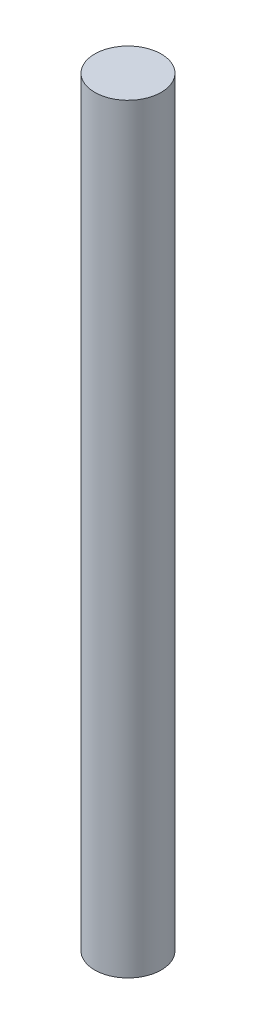
ISO-10303-21;
HEADER;
FILE_DESCRIPTION(('STEP AP214'),'2;1');
FILE_NAME('part.step','',(''),(''),'','','');
FILE_SCHEMA(('AUTOMOTIVE_DESIGN { 1 0 10303 214 1 1 1 1 }'));
ENDSEC;
DATA;
#1=APPLICATION_CONTEXT('core data for automotive mechanical design processes');
#2=APPLICATION_PROTOCOL_DEFINITION('international standard','automotive_design',2000,#1);
#3=PRODUCT_CONTEXT('',#1,'mechanical');
#4=PRODUCT('Part','Part','',(#3));
#5=PRODUCT_RELATED_PRODUCT_CATEGORY('part','',(#4));
#6=PRODUCT_DEFINITION_FORMATION('','',#4);
#7=PRODUCT_DEFINITION_CONTEXT('part definition',#1,'design');
#8=PRODUCT_DEFINITION('design','',#6,#7);
#9=PRODUCT_DEFINITION_SHAPE('','',#8);
#10=(LENGTH_UNIT() NAMED_UNIT(*) SI_UNIT(.MILLI.,.METRE.));
#11=(NAMED_UNIT(*) PLANE_ANGLE_UNIT() SI_UNIT($,.RADIAN.));
#12=(NAMED_UNIT(*) SI_UNIT($,.STERADIAN.) SOLID_ANGLE_UNIT());
#13=UNCERTAINTY_MEASURE_WITH_UNIT(LENGTH_MEASURE(1.E-05),#10,'distance_accuracy_value','');
#14=(GEOMETRIC_REPRESENTATION_CONTEXT(3) GLOBAL_UNCERTAINTY_ASSIGNED_CONTEXT((#13)) GLOBAL_UNIT_ASSIGNED_CONTEXT((#10,
#11,#12)) REPRESENTATION_CONTEXT('',''));
#15=CARTESIAN_POINT('',(0.,0.,0.));
#16=DIRECTION('',(0.,0.,1.));
#17=DIRECTION('',(1.,0.,0.));
#18=AXIS2_PLACEMENT_3D('',#15,#16,#17);
#19=CARTESIAN_POINT('',(0.,40.,0.));
#20=DIRECTION('',(0.,-1.,0.));
#21=DIRECTION('',(0.,0.,-1.));
#22=AXIS2_PLACEMENT_3D('',#19,#20,#21);
#23=CYLINDRICAL_SURFACE('',#22,1.75);
#24=CARTESIAN_POINT('',(0.,40.,0.));
#25=DIRECTION('',(0.,1.,0.));
#26=DIRECTION('',(0.,0.,1.));
#27=AXIS2_PLACEMENT_3D('',#24,#25,#26);
#28=CIRCLE('',#27,1.75);
#29=CARTESIAN_POINT('',(0.,40.,1.75));
#30=VERTEX_POINT('',#29);
#31=EDGE_CURVE('E10',#30,#30,#28,.T.);
#32=ORIENTED_EDGE('',*,*,#31,.F.);
#33=EDGE_LOOP('',(#32));
#34=FACE_BOUND('',#33,.T.);
#35=CARTESIAN_POINT('',(0.,0.,0.));
#36=DIRECTION('',(0.,1.,0.));
#37=DIRECTION('',(0.,0.,1.));
#38=AXIS2_PLACEMENT_3D('',#35,#36,#37);
#39=CIRCLE('',#38,1.75);
#40=CARTESIAN_POINT('',(0.,0.,1.75));
#41=VERTEX_POINT('',#40);
#42=EDGE_CURVE('E36',#41,#41,#39,.T.);
#43=ORIENTED_EDGE('',*,*,#42,.T.);
#44=EDGE_LOOP('',(#43));
#45=FACE_BOUND('',#44,.T.);
#46=ADVANCED_FACE('F33',(#34,#45),#23,.T.);
#47=CARTESIAN_POINT('',(0.,40.,0.));
#48=DIRECTION('',(0.,1.,0.));
#49=DIRECTION('',(0.,0.,1.));
#50=AXIS2_PLACEMENT_3D('',#47,#48,#49);
#51=PLANE('',#50);
#52=ORIENTED_EDGE('',*,*,#31,.T.);
#53=EDGE_LOOP('',(#52));
#54=FACE_BOUND('',#53,.T.);
#55=ADVANCED_FACE('F48',(#54),#51,.T.);
#56=CARTESIAN_POINT('',(0.,0.,0.));
#57=DIRECTION('',(0.,1.,0.));
#58=DIRECTION('',(0.,0.,1.));
#59=AXIS2_PLACEMENT_3D('',#56,#57,#58);
#60=PLANE('',#59);
#61=ORIENTED_EDGE('',*,*,#42,.F.);
#62=EDGE_LOOP('',(#61));
#63=FACE_BOUND('',#62,.T.);
#64=ADVANCED_FACE('F46',(#63),#60,.F.);
#65=CLOSED_SHELL('',(#46,#55,#64));
#66=MANIFOLD_SOLID_BREP('B2',#65);
#67=ADVANCED_BREP_SHAPE_REPRESENTATION('',(#18,#66),#14);
#68=SHAPE_DEFINITION_REPRESENTATION(#9,#67);
ENDSEC;
END-ISO-10303-21;
